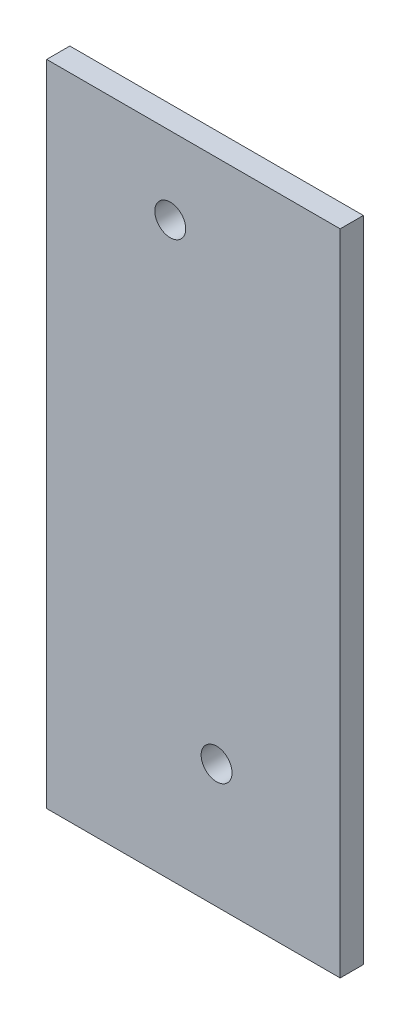
ISO-10303-21;
HEADER;
FILE_DESCRIPTION(('STEP AP214'),'2;1');
FILE_NAME('part.step','',(''),(''),'','','');
FILE_SCHEMA(('AUTOMOTIVE_DESIGN { 1 0 10303 214 1 1 1 1 }'));
ENDSEC;
DATA;
#1=APPLICATION_CONTEXT('core data for automotive mechanical design processes');
#2=APPLICATION_PROTOCOL_DEFINITION('international standard','automotive_design',2000,#1);
#3=PRODUCT_CONTEXT('',#1,'mechanical');
#4=PRODUCT('Part','Part','',(#3));
#5=PRODUCT_RELATED_PRODUCT_CATEGORY('part','',(#4));
#6=PRODUCT_DEFINITION_FORMATION('','',#4);
#7=PRODUCT_DEFINITION_CONTEXT('part definition',#1,'design');
#8=PRODUCT_DEFINITION('design','',#6,#7);
#9=PRODUCT_DEFINITION_SHAPE('','',#8);
#10=(LENGTH_UNIT() NAMED_UNIT(*) SI_UNIT(.MILLI.,.METRE.));
#11=(NAMED_UNIT(*) PLANE_ANGLE_UNIT() SI_UNIT($,.RADIAN.));
#12=(NAMED_UNIT(*) SI_UNIT($,.STERADIAN.) SOLID_ANGLE_UNIT());
#13=UNCERTAINTY_MEASURE_WITH_UNIT(LENGTH_MEASURE(1.E-05),#10,'distance_accuracy_value','');
#14=(GEOMETRIC_REPRESENTATION_CONTEXT(3) GLOBAL_UNCERTAINTY_ASSIGNED_CONTEXT((#13)) GLOBAL_UNIT_ASSIGNED_CONTEXT((#10,
#11,#12)) REPRESENTATION_CONTEXT('',''));
#15=CARTESIAN_POINT('',(0.,0.,0.));
#16=DIRECTION('',(0.,0.,1.));
#17=DIRECTION('',(1.,0.,0.));
#18=AXIS2_PLACEMENT_3D('',#15,#16,#17);
#19=CARTESIAN_POINT('',(57.,165.,3.));
#20=DIRECTION('',(1.,0.,0.));
#21=DIRECTION('',(0.,1.,0.));
#22=AXIS2_PLACEMENT_3D('',#19,#20,#21);
#23=PLANE('',#22);
#24=DIRECTION('',(0.,-1.,0.));
#25=VECTOR('',#24,1.);
#26=CARTESIAN_POINT('',(57.,165.,0.));
#27=LINE('',#26,#25);
#28=CARTESIAN_POINT('',(57.,165.,0.));
#29=VERTEX_POINT('',#28);
#30=CARTESIAN_POINT('',(57.,81.,0.));
#31=VERTEX_POINT('',#30);
#32=EDGE_CURVE('E86',#29,#31,#27,.T.);
#33=ORIENTED_EDGE('',*,*,#32,.T.);
#34=DIRECTION('',(0.,0.,1.));
#35=VECTOR('',#34,1.);
#36=CARTESIAN_POINT('',(57.,81.,-0.00100000000000013));
#37=LINE('',#36,#35);
#38=CARTESIAN_POINT('',(57.,81.,3.));
#39=VERTEX_POINT('',#38);
#40=EDGE_CURVE('E52',#31,#39,#37,.T.);
#41=ORIENTED_EDGE('',*,*,#40,.T.);
#42=DIRECTION('',(0.,-1.,0.));
#43=VECTOR('',#42,1.);
#44=CARTESIAN_POINT('',(57.,165.,3.));
#45=LINE('',#44,#43);
#46=CARTESIAN_POINT('',(57.,165.,3.));
#47=VERTEX_POINT('',#46);
#48=EDGE_CURVE('E81',#47,#39,#45,.T.);
#49=ORIENTED_EDGE('',*,*,#48,.F.);
#50=DIRECTION('',(0.,0.,-1.));
#51=VECTOR('',#50,1.);
#52=CARTESIAN_POINT('',(57.,165.,3.));
#53=LINE('',#52,#51);
#54=EDGE_CURVE('E45',#47,#29,#53,.T.);
#55=ORIENTED_EDGE('',*,*,#54,.T.);
#56=EDGE_LOOP('',(#33,#41,#49,#55));
#57=FACE_BOUND('',#56,.T.);
#58=ADVANCED_FACE('F38',(#57),#23,.F.);
#59=CARTESIAN_POINT('',(95.,165.,3.));
#60=DIRECTION('',(-1.,0.,0.));
#61=DIRECTION('',(0.,-1.,0.));
#62=AXIS2_PLACEMENT_3D('',#59,#60,#61);
#63=PLANE('',#62);
#64=DIRECTION('',(0.,1.,0.));
#65=VECTOR('',#64,1.);
#66=CARTESIAN_POINT('',(95.,165.,3.));
#67=LINE('',#66,#65);
#68=CARTESIAN_POINT('',(95.,81.,3.));
#69=VERTEX_POINT('',#68);
#70=CARTESIAN_POINT('',(95.,165.,3.));
#71=VERTEX_POINT('',#70);
#72=EDGE_CURVE('E98',#69,#71,#67,.T.);
#73=ORIENTED_EDGE('',*,*,#72,.F.);
#74=DIRECTION('',(0.,0.,1.));
#75=VECTOR('',#74,1.);
#76=CARTESIAN_POINT('',(95.,81.,-0.00100000000000013));
#77=LINE('',#76,#75);
#78=CARTESIAN_POINT('',(95.,81.,0.));
#79=VERTEX_POINT('',#78);
#80=EDGE_CURVE('E109',#79,#69,#77,.T.);
#81=ORIENTED_EDGE('',*,*,#80,.F.);
#82=DIRECTION('',(0.,1.,0.));
#83=VECTOR('',#82,1.);
#84=CARTESIAN_POINT('',(95.,165.,0.));
#85=LINE('',#84,#83);
#86=CARTESIAN_POINT('',(95.,165.,0.));
#87=VERTEX_POINT('',#86);
#88=EDGE_CURVE('E82',#79,#87,#85,.T.);
#89=ORIENTED_EDGE('',*,*,#88,.T.);
#90=DIRECTION('',(0.,0.,-1.));
#91=VECTOR('',#90,1.);
#92=CARTESIAN_POINT('',(95.,165.,3.));
#93=LINE('',#92,#91);
#94=EDGE_CURVE('E11',#71,#87,#93,.T.);
#95=ORIENTED_EDGE('',*,*,#94,.F.);
#96=EDGE_LOOP('',(#73,#81,#89,#95));
#97=FACE_BOUND('',#96,.T.);
#98=ADVANCED_FACE('F132',(#97),#63,.F.);
#99=CARTESIAN_POINT('',(57.,165.,3.));
#100=DIRECTION('',(0.,-1.,0.));
#101=DIRECTION('',(0.,0.,-1.));
#102=AXIS2_PLACEMENT_3D('',#99,#100,#101);
#103=PLANE('',#102);
#104=DIRECTION('',(-1.,0.,0.));
#105=VECTOR('',#104,1.);
#106=CARTESIAN_POINT('',(57.,165.,0.));
#107=LINE('',#106,#105);
#108=EDGE_CURVE('E73',#87,#29,#107,.T.);
#109=ORIENTED_EDGE('',*,*,#108,.T.);
#110=ORIENTED_EDGE('',*,*,#54,.F.);
#111=DIRECTION('',(-1.,0.,0.));
#112=VECTOR('',#111,1.);
#113=CARTESIAN_POINT('',(57.,165.,3.));
#114=LINE('',#113,#112);
#115=EDGE_CURVE('E61',#71,#47,#114,.T.);
#116=ORIENTED_EDGE('',*,*,#115,.F.);
#117=ORIENTED_EDGE('',*,*,#94,.T.);
#118=EDGE_LOOP('',(#109,#110,#116,#117));
#119=FACE_BOUND('',#118,.T.);
#120=ADVANCED_FACE('F75',(#119),#103,.F.);
#121=CARTESIAN_POINT('',(0.,0.,3.));
#122=DIRECTION('',(0.,0.,-1.));
#123=DIRECTION('',(-1.,0.,0.));
#124=AXIS2_PLACEMENT_3D('',#121,#122,#123);
#125=PLANE('',#124);
#126=CARTESIAN_POINT('',(73.,155.,3.));
#127=DIRECTION('',(0.,0.,1.));
#128=DIRECTION('',(1.,0.,0.));
#129=AXIS2_PLACEMENT_3D('',#126,#127,#128);
#130=CIRCLE('',#129,2.);
#131=CARTESIAN_POINT('',(75.,155.,3.));
#132=VERTEX_POINT('',#131);
#133=EDGE_CURVE('E90',#132,#132,#130,.T.);
#134=ORIENTED_EDGE('',*,*,#133,.F.);
#135=EDGE_LOOP('',(#134));
#136=FACE_BOUND('',#135,.T.);
#137=CARTESIAN_POINT('',(79.,97.,3.));
#138=DIRECTION('',(0.,0.,1.));
#139=DIRECTION('',(1.,0.,0.));
#140=AXIS2_PLACEMENT_3D('',#137,#138,#139);
#141=CIRCLE('',#140,2.);
#142=CARTESIAN_POINT('',(81.,97.,3.));
#143=VERTEX_POINT('',#142);
#144=EDGE_CURVE('E104',#143,#143,#141,.T.);
#145=ORIENTED_EDGE('',*,*,#144,.F.);
#146=EDGE_LOOP('',(#145));
#147=FACE_BOUND('',#146,.T.);
#148=ORIENTED_EDGE('',*,*,#48,.T.);
#149=DIRECTION('',(-1.,0.,0.));
#150=VECTOR('',#149,1.);
#151=CARTESIAN_POINT('',(57.,81.,3.));
#152=LINE('',#151,#150);
#153=EDGE_CURVE('E112',#69,#39,#152,.T.);
#154=ORIENTED_EDGE('',*,*,#153,.F.);
#155=ORIENTED_EDGE('',*,*,#72,.T.);
#156=ORIENTED_EDGE('',*,*,#115,.T.);
#157=EDGE_LOOP('',(#148,#154,#155,#156));
#158=FACE_BOUND('',#157,.T.);
#159=ADVANCED_FACE('F122',(#136,#147,#158),#125,.F.);
#160=CARTESIAN_POINT('',(0.,0.,0.));
#161=DIRECTION('',(0.,0.,-1.));
#162=DIRECTION('',(-1.,0.,0.));
#163=AXIS2_PLACEMENT_3D('',#160,#161,#162);
#164=PLANE('',#163);
#165=DIRECTION('',(-1.,0.,0.));
#166=VECTOR('',#165,1.);
#167=CARTESIAN_POINT('',(57.,81.,0.));
#168=LINE('',#167,#166);
#169=EDGE_CURVE('E89',#79,#31,#168,.T.);
#170=ORIENTED_EDGE('',*,*,#169,.T.);
#171=ORIENTED_EDGE('',*,*,#32,.F.);
#172=ORIENTED_EDGE('',*,*,#108,.F.);
#173=ORIENTED_EDGE('',*,*,#88,.F.);
#174=EDGE_LOOP('',(#170,#171,#172,#173));
#175=FACE_BOUND('',#174,.T.);
#176=CARTESIAN_POINT('',(73.,155.,0.));
#177=DIRECTION('',(0.,0.,-1.));
#178=DIRECTION('',(-1.,0.,0.));
#179=AXIS2_PLACEMENT_3D('',#176,#177,#178);
#180=CIRCLE('',#179,2.);
#181=CARTESIAN_POINT('',(75.,155.,0.));
#182=VERTEX_POINT('',#181);
#183=EDGE_CURVE('E94',#182,#182,#180,.F.);
#184=ORIENTED_EDGE('',*,*,#183,.T.);
#185=EDGE_LOOP('',(#184));
#186=FACE_BOUND('',#185,.T.);
#187=CARTESIAN_POINT('',(79.,97.,0.));
#188=DIRECTION('',(0.,0.,-1.));
#189=DIRECTION('',(-1.,0.,0.));
#190=AXIS2_PLACEMENT_3D('',#187,#188,#189);
#191=CIRCLE('',#190,2.);
#192=CARTESIAN_POINT('',(81.,97.,0.));
#193=VERTEX_POINT('',#192);
#194=EDGE_CURVE('E101',#193,#193,#191,.F.);
#195=ORIENTED_EDGE('',*,*,#194,.T.);
#196=EDGE_LOOP('',(#195));
#197=FACE_BOUND('',#196,.T.);
#198=ADVANCED_FACE('F87',(#175,#186,#197),#164,.T.);
#199=CARTESIAN_POINT('',(79.,97.,-0.00100000000000013));
#200=DIRECTION('',(0.,0.,1.));
#201=DIRECTION('',(1.,0.,0.));
#202=AXIS2_PLACEMENT_3D('',#199,#200,#201);
#203=CYLINDRICAL_SURFACE('',#202,2.);
#204=CARTESIAN_POINT('',(81.,97.,0.));
#205=CARTESIAN_POINT('',(81.,97.,0.03125));
#206=CARTESIAN_POINT('',(81.,97.,0.0625));
#207=CARTESIAN_POINT('',(81.,97.,0.125));
#208=CARTESIAN_POINT('',(81.,97.,0.15625));
#209=CARTESIAN_POINT('',(81.,97.,0.21875));
#210=CARTESIAN_POINT('',(81.,97.,0.25));
#211=CARTESIAN_POINT('',(81.,97.,0.3125));
#212=CARTESIAN_POINT('',(81.,97.,0.34375));
#213=CARTESIAN_POINT('',(81.,97.,0.40625));
#214=CARTESIAN_POINT('',(81.,97.,0.4375));
#215=CARTESIAN_POINT('',(81.,97.,0.5));
#216=CARTESIAN_POINT('',(81.,97.,0.53125));
#217=CARTESIAN_POINT('',(81.,97.,0.59375));
#218=CARTESIAN_POINT('',(81.,97.,0.625));
#219=CARTESIAN_POINT('',(81.,97.,0.6875));
#220=CARTESIAN_POINT('',(81.,97.,0.71875));
#221=CARTESIAN_POINT('',(81.,97.,0.78125));
#222=CARTESIAN_POINT('',(81.,97.,0.8125));
#223=CARTESIAN_POINT('',(81.,97.,0.875));
#224=CARTESIAN_POINT('',(81.,97.,0.90625));
#225=CARTESIAN_POINT('',(81.,97.,0.96875));
#226=CARTESIAN_POINT('',(81.,97.,1.));
#227=CARTESIAN_POINT('',(81.,97.,1.0625));
#228=CARTESIAN_POINT('',(81.,97.,1.09375));
#229=CARTESIAN_POINT('',(81.,97.,1.15625));
#230=CARTESIAN_POINT('',(81.,97.,1.1875));
#231=CARTESIAN_POINT('',(81.,97.,1.25));
#232=CARTESIAN_POINT('',(81.,97.,1.28125));
#233=CARTESIAN_POINT('',(81.,97.,1.34375));
#234=CARTESIAN_POINT('',(81.,97.,1.375));
#235=CARTESIAN_POINT('',(81.,97.,1.4375));
#236=CARTESIAN_POINT('',(81.,97.,1.46875));
#237=CARTESIAN_POINT('',(81.,97.,1.53125));
#238=CARTESIAN_POINT('',(81.,97.,1.5625));
#239=CARTESIAN_POINT('',(81.,97.,1.625));
#240=CARTESIAN_POINT('',(81.,97.,1.65625));
#241=CARTESIAN_POINT('',(81.,97.,1.71875));
#242=CARTESIAN_POINT('',(81.,97.,1.75));
#243=CARTESIAN_POINT('',(81.,97.,1.8125));
#244=CARTESIAN_POINT('',(81.,97.,1.84375));
#245=CARTESIAN_POINT('',(81.,97.,1.90625));
#246=CARTESIAN_POINT('',(81.,97.,1.9375));
#247=CARTESIAN_POINT('',(81.,97.,2.));
#248=CARTESIAN_POINT('',(81.,97.,2.03125));
#249=CARTESIAN_POINT('',(81.,97.,2.09375));
#250=CARTESIAN_POINT('',(81.,97.,2.125));
#251=CARTESIAN_POINT('',(81.,97.,2.1875));
#252=CARTESIAN_POINT('',(81.,97.,2.21875));
#253=CARTESIAN_POINT('',(81.,97.,2.28125));
#254=CARTESIAN_POINT('',(81.,97.,2.3125));
#255=CARTESIAN_POINT('',(81.,97.,2.375));
#256=CARTESIAN_POINT('',(81.,97.,2.40625));
#257=CARTESIAN_POINT('',(81.,97.,2.46875));
#258=CARTESIAN_POINT('',(81.,97.,2.5));
#259=CARTESIAN_POINT('',(81.,97.,2.5625));
#260=CARTESIAN_POINT('',(81.,97.,2.59375));
#261=CARTESIAN_POINT('',(81.,97.,2.65625));
#262=CARTESIAN_POINT('',(81.,97.,2.6875));
#263=CARTESIAN_POINT('',(81.,97.,2.75));
#264=CARTESIAN_POINT('',(81.,97.,2.78125));
#265=CARTESIAN_POINT('',(81.,97.,2.84375));
#266=CARTESIAN_POINT('',(81.,97.,2.875));
#267=CARTESIAN_POINT('',(81.,97.,2.9375));
#268=CARTESIAN_POINT('',(81.,97.,2.96875));
#269=CARTESIAN_POINT('',(81.,97.,3.));
#270=B_SPLINE_CURVE_WITH_KNOTS('',3,(#204,#205,#206,#207,#208,#209,#210,#211,#212,#213,#214,
#215,#216,#217,#218,#219,#220,#221,#222,#223,#224,#225,#226,#227,#228,#229,#230,#231,#232,#233,
#234,#235,#236,#237,#238,#239,#240,#241,#242,#243,#244,#245,#246,#247,#248,#249,#250,#251,#252,
#253,#254,#255,#256,#257,#258,#259,#260,#261,#262,#263,#264,#265,#266,#267,#268,#269),
.UNSPECIFIED.,.F.,.F.,(4,2,2,2,2,2,2,2,2,2,2,2,2,2,2,2,2,2,2,2,2,2,2,2,2,2,2,2,2,2,2,2,4),(0.,
0.09375,0.1875,0.28125,0.375,0.46875,0.5625,0.65625,0.75,0.84375,0.9375,1.03125,1.125,1.21875,
1.3125,1.40625,1.5,1.59375,1.6875,1.78125,1.875,1.96875,2.0625,2.15625,2.25,2.34375,2.4375,
2.53125,2.625,2.71875,2.8125,2.90625,3.),.UNSPECIFIED.);
#271=EDGE_CURVE('BSEAM129',#193,#143,#270,.T.);
#272=ORIENTED_EDGE('',*,*,#194,.F.);
#273=ORIENTED_EDGE('',*,*,#144,.T.);
#274=ORIENTED_EDGE('',*,*,#271,.T.);
#275=ORIENTED_EDGE('',*,*,#271,.F.);
#276=EDGE_LOOP('',(#272,#274,#273,#275));
#277=FACE_BOUND('',#276,.T.);
#278=ADVANCED_FACE('F129',(#277),#203,.F.);
#279=CARTESIAN_POINT('',(73.,155.,-0.00100000000000013));
#280=DIRECTION('',(0.,0.,1.));
#281=DIRECTION('',(1.,0.,0.));
#282=AXIS2_PLACEMENT_3D('',#279,#280,#281);
#283=CYLINDRICAL_SURFACE('',#282,2.);
#284=CARTESIAN_POINT('',(75.,155.,0.));
#285=CARTESIAN_POINT('',(75.,155.,0.03125));
#286=CARTESIAN_POINT('',(75.,155.,0.0625));
#287=CARTESIAN_POINT('',(75.,155.,0.125));
#288=CARTESIAN_POINT('',(75.,155.,0.15625));
#289=CARTESIAN_POINT('',(75.,155.,0.21875));
#290=CARTESIAN_POINT('',(75.,155.,0.25));
#291=CARTESIAN_POINT('',(75.,155.,0.3125));
#292=CARTESIAN_POINT('',(75.,155.,0.34375));
#293=CARTESIAN_POINT('',(75.,155.,0.40625));
#294=CARTESIAN_POINT('',(75.,155.,0.4375));
#295=CARTESIAN_POINT('',(75.,155.,0.5));
#296=CARTESIAN_POINT('',(75.,155.,0.53125));
#297=CARTESIAN_POINT('',(75.,155.,0.59375));
#298=CARTESIAN_POINT('',(75.,155.,0.625));
#299=CARTESIAN_POINT('',(75.,155.,0.6875));
#300=CARTESIAN_POINT('',(75.,155.,0.71875));
#301=CARTESIAN_POINT('',(75.,155.,0.78125));
#302=CARTESIAN_POINT('',(75.,155.,0.8125));
#303=CARTESIAN_POINT('',(75.,155.,0.875));
#304=CARTESIAN_POINT('',(75.,155.,0.90625));
#305=CARTESIAN_POINT('',(75.,155.,0.96875));
#306=CARTESIAN_POINT('',(75.,155.,1.));
#307=CARTESIAN_POINT('',(75.,155.,1.0625));
#308=CARTESIAN_POINT('',(75.,155.,1.09375));
#309=CARTESIAN_POINT('',(75.,155.,1.15625));
#310=CARTESIAN_POINT('',(75.,155.,1.1875));
#311=CARTESIAN_POINT('',(75.,155.,1.25));
#312=CARTESIAN_POINT('',(75.,155.,1.28125));
#313=CARTESIAN_POINT('',(75.,155.,1.34375));
#314=CARTESIAN_POINT('',(75.,155.,1.375));
#315=CARTESIAN_POINT('',(75.,155.,1.4375));
#316=CARTESIAN_POINT('',(75.,155.,1.46875));
#317=CARTESIAN_POINT('',(75.,155.,1.53125));
#318=CARTESIAN_POINT('',(75.,155.,1.5625));
#319=CARTESIAN_POINT('',(75.,155.,1.625));
#320=CARTESIAN_POINT('',(75.,155.,1.65625));
#321=CARTESIAN_POINT('',(75.,155.,1.71875));
#322=CARTESIAN_POINT('',(75.,155.,1.75));
#323=CARTESIAN_POINT('',(75.,155.,1.8125));
#324=CARTESIAN_POINT('',(75.,155.,1.84375));
#325=CARTESIAN_POINT('',(75.,155.,1.90625));
#326=CARTESIAN_POINT('',(75.,155.,1.9375));
#327=CARTESIAN_POINT('',(75.,155.,2.));
#328=CARTESIAN_POINT('',(75.,155.,2.03125));
#329=CARTESIAN_POINT('',(75.,155.,2.09375));
#330=CARTESIAN_POINT('',(75.,155.,2.125));
#331=CARTESIAN_POINT('',(75.,155.,2.1875));
#332=CARTESIAN_POINT('',(75.,155.,2.21875));
#333=CARTESIAN_POINT('',(75.,155.,2.28125));
#334=CARTESIAN_POINT('',(75.,155.,2.3125));
#335=CARTESIAN_POINT('',(75.,155.,2.375));
#336=CARTESIAN_POINT('',(75.,155.,2.40625));
#337=CARTESIAN_POINT('',(75.,155.,2.46875));
#338=CARTESIAN_POINT('',(75.,155.,2.5));
#339=CARTESIAN_POINT('',(75.,155.,2.5625));
#340=CARTESIAN_POINT('',(75.,155.,2.59375));
#341=CARTESIAN_POINT('',(75.,155.,2.65625));
#342=CARTESIAN_POINT('',(75.,155.,2.6875));
#343=CARTESIAN_POINT('',(75.,155.,2.75));
#344=CARTESIAN_POINT('',(75.,155.,2.78125));
#345=CARTESIAN_POINT('',(75.,155.,2.84375));
#346=CARTESIAN_POINT('',(75.,155.,2.875));
#347=CARTESIAN_POINT('',(75.,155.,2.9375));
#348=CARTESIAN_POINT('',(75.,155.,2.96875));
#349=CARTESIAN_POINT('',(75.,155.,3.));
#350=B_SPLINE_CURVE_WITH_KNOTS('',3,(#284,#285,#286,#287,#288,#289,#290,#291,#292,#293,#294,
#295,#296,#297,#298,#299,#300,#301,#302,#303,#304,#305,#306,#307,#308,#309,#310,#311,#312,#313,
#314,#315,#316,#317,#318,#319,#320,#321,#322,#323,#324,#325,#326,#327,#328,#329,#330,#331,#332,
#333,#334,#335,#336,#337,#338,#339,#340,#341,#342,#343,#344,#345,#346,#347,#348,#349),
.UNSPECIFIED.,.F.,.F.,(4,2,2,2,2,2,2,2,2,2,2,2,2,2,2,2,2,2,2,2,2,2,2,2,2,2,2,2,2,2,2,2,4),(0.,
0.09375,0.1875,0.28125,0.375,0.46875,0.5625,0.65625,0.75,0.84375,0.9375,1.03125,1.125,1.21875,
1.3125,1.40625,1.5,1.59375,1.6875,1.78125,1.875,1.96875,2.0625,2.15625,2.25,2.34375,2.4375,
2.53125,2.625,2.71875,2.8125,2.90625,3.),.UNSPECIFIED.);
#351=EDGE_CURVE('BSEAM163',#182,#132,#350,.T.);
#352=ORIENTED_EDGE('',*,*,#183,.F.);
#353=ORIENTED_EDGE('',*,*,#133,.T.);
#354=ORIENTED_EDGE('',*,*,#351,.T.);
#355=ORIENTED_EDGE('',*,*,#351,.F.);
#356=EDGE_LOOP('',(#352,#354,#353,#355));
#357=FACE_BOUND('',#356,.T.);
#358=ADVANCED_FACE('F163',(#357),#283,.F.);
#359=CARTESIAN_POINT('',(57.,81.,-0.00100000000000013));
#360=DIRECTION('',(0.,1.,0.));
#361=DIRECTION('',(0.,0.,1.));
#362=AXIS2_PLACEMENT_3D('',#359,#360,#361);
#363=PLANE('',#362);
#364=ORIENTED_EDGE('',*,*,#80,.T.);
#365=ORIENTED_EDGE('',*,*,#153,.T.);
#366=ORIENTED_EDGE('',*,*,#40,.F.);
#367=ORIENTED_EDGE('',*,*,#169,.F.);
#368=EDGE_LOOP('',(#364,#365,#366,#367));
#369=FACE_BOUND('',#368,.T.);
#370=ADVANCED_FACE('F117',(#369),#363,.F.);
#371=CLOSED_SHELL('',(#58,#98,#120,#159,#198,#278,#358,#370));
#372=MANIFOLD_SOLID_BREP('B2',#371);
#373=ADVANCED_BREP_SHAPE_REPRESENTATION('',(#18,#372),#14);
#374=SHAPE_DEFINITION_REPRESENTATION(#9,#373);
ENDSEC;
END-ISO-10303-21;
